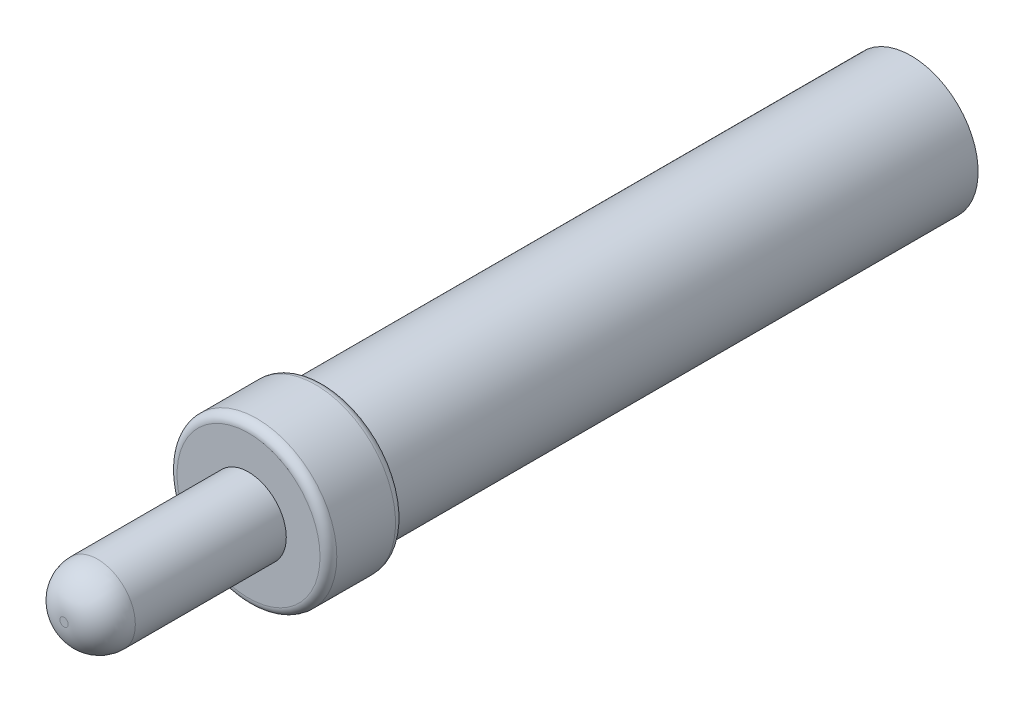
ISO-10303-21;
HEADER;
FILE_DESCRIPTION(('STEP AP214'),'2;1');
FILE_NAME('part.step','',(''),(''),'','','');
FILE_SCHEMA(('AUTOMOTIVE_DESIGN { 1 0 10303 214 1 1 1 1 }'));
ENDSEC;
DATA;
#1=APPLICATION_CONTEXT('core data for automotive mechanical design processes');
#2=APPLICATION_PROTOCOL_DEFINITION('international standard','automotive_design',2000,#1);
#3=PRODUCT_CONTEXT('',#1,'mechanical');
#4=PRODUCT('Part','Part','',(#3));
#5=PRODUCT_RELATED_PRODUCT_CATEGORY('part','',(#4));
#6=PRODUCT_DEFINITION_FORMATION('','',#4);
#7=PRODUCT_DEFINITION_CONTEXT('part definition',#1,'design');
#8=PRODUCT_DEFINITION('design','',#6,#7);
#9=PRODUCT_DEFINITION_SHAPE('','',#8);
#10=(LENGTH_UNIT() NAMED_UNIT(*) SI_UNIT(.MILLI.,.METRE.));
#11=(NAMED_UNIT(*) PLANE_ANGLE_UNIT() SI_UNIT($,.RADIAN.));
#12=(NAMED_UNIT(*) SI_UNIT($,.STERADIAN.) SOLID_ANGLE_UNIT());
#13=UNCERTAINTY_MEASURE_WITH_UNIT(LENGTH_MEASURE(1.E-05),#10,'distance_accuracy_value','');
#14=(GEOMETRIC_REPRESENTATION_CONTEXT(3) GLOBAL_UNCERTAINTY_ASSIGNED_CONTEXT((#13)) GLOBAL_UNIT_ASSIGNED_CONTEXT((#10,
#11,#12)) REPRESENTATION_CONTEXT('',''));
#15=CARTESIAN_POINT('',(0.,0.,0.));
#16=DIRECTION('',(0.,0.,1.));
#17=DIRECTION('',(1.,0.,0.));
#18=AXIS2_PLACEMENT_3D('',#15,#16,#17);
#19=CARTESIAN_POINT('',(240.708388301789,2.59608285867283,50.5));
#20=DIRECTION('',(0.,0.,-1.));
#21=DIRECTION('',(-1.,0.,0.));
#22=AXIS2_PLACEMENT_3D('',#19,#20,#21);
#23=CYLINDRICAL_SURFACE('',#22,4.76250000000001);
#24=CARTESIAN_POINT('',(240.708388301789,2.59608285867283,35.5));
#25=DIRECTION('',(0.,0.,-1.));
#26=DIRECTION('',(-1.,0.,0.));
#27=AXIS2_PLACEMENT_3D('',#24,#25,#26);
#28=CIRCLE('',#27,4.76250000000001);
#29=CARTESIAN_POINT('',(235.945888301789,2.59608285867283,35.5));
#30=VERTEX_POINT('',#29);
#31=EDGE_CURVE('E68',#30,#30,#28,.F.);
#32=ORIENTED_EDGE('',*,*,#31,.T.);
#33=EDGE_LOOP('',(#32));
#34=FACE_BOUND('',#33,.T.);
#35=CARTESIAN_POINT('',(240.708388301789,2.59608285867283,39.));
#36=DIRECTION('',(0.,0.,1.));
#37=DIRECTION('',(1.,0.,0.));
#38=AXIS2_PLACEMENT_3D('',#35,#36,#37);
#39=CIRCLE('',#38,4.76250000000001);
#40=CARTESIAN_POINT('',(245.470888301789,2.59608285867283,39.));
#41=VERTEX_POINT('',#40);
#42=EDGE_CURVE('E59',#41,#41,#39,.F.);
#43=ORIENTED_EDGE('',*,*,#42,.T.);
#44=EDGE_LOOP('',(#43));
#45=FACE_BOUND('',#44,.T.);
#46=ADVANCED_FACE('F35',(#34,#45),#23,.T.);
#47=CARTESIAN_POINT('',(240.708388301789,2.59608285867283,0.));
#48=DIRECTION('',(0.,0.,1.));
#49=DIRECTION('',(1.,0.,0.));
#50=AXIS2_PLACEMENT_3D('',#47,#48,#49);
#51=PLANE('',#50);
#52=CARTESIAN_POINT('',(240.708388301787,2.59608285867252,0.));
#53=DIRECTION('',(0.,0.,-1.));
#54=DIRECTION('',(-1.,0.,0.));
#55=AXIS2_PLACEMENT_3D('',#52,#53,#54);
#56=CIRCLE('',#55,1.25);
#57=CARTESIAN_POINT('',(239.458388301787,2.59608285867252,0.));
#58=VERTEX_POINT('',#57);
#59=EDGE_CURVE('E56',#58,#58,#56,.T.);
#60=ORIENTED_EDGE('',*,*,#59,.F.);
#61=EDGE_LOOP('',(#60));
#62=FACE_BOUND('',#61,.T.);
#63=CARTESIAN_POINT('',(240.708388301787,2.59608285867252,0.));
#64=DIRECTION('',(0.,0.,-1.));
#65=DIRECTION('',(-1.,0.,0.));
#66=AXIS2_PLACEMENT_3D('',#63,#64,#65);
#67=CIRCLE('',#66,3.99999999999999);
#68=CARTESIAN_POINT('',(236.708388301787,2.59608285867252,0.));
#69=VERTEX_POINT('',#68);
#70=EDGE_CURVE('E116',#69,#69,#67,.T.);
#71=ORIENTED_EDGE('',*,*,#70,.T.);
#72=EDGE_LOOP('',(#71));
#73=FACE_BOUND('',#72,.T.);
#74=ADVANCED_FACE('F49',(#62,#73),#51,.F.);
#75=CARTESIAN_POINT('',(240.708388301787,2.59608285867252,8.49999999999999));
#76=DIRECTION('',(0.,0.,-1.));
#77=DIRECTION('',(-1.,0.,0.));
#78=AXIS2_PLACEMENT_3D('',#75,#76,#77);
#79=CONICAL_SURFACE('',#78,1.25,1.02974425867666);
#80=CARTESIAN_POINT('',(240.708388301787,2.59608285867252,9.25107577378444));
#81=VERTEX_POINT('',#80);
#82=VERTEX_LOOP('',#81);
#83=FACE_BOUND('',#82,.T.);
#84=CARTESIAN_POINT('',(240.708388301787,2.59608285867252,8.49999999999999));
#85=DIRECTION('',(0.,0.,-1.));
#86=DIRECTION('',(-1.,0.,0.));
#87=AXIS2_PLACEMENT_3D('',#84,#85,#86);
#88=CIRCLE('',#87,1.25);
#89=CARTESIAN_POINT('',(239.458388301787,2.59608285867252,8.49999999999999));
#90=VERTEX_POINT('',#89);
#91=EDGE_CURVE('E53',#90,#90,#88,.T.);
#92=ORIENTED_EDGE('',*,*,#91,.T.);
#93=EDGE_LOOP('',(#92));
#94=FACE_BOUND('',#93,.T.);
#95=ADVANCED_FACE('F45',(#83,#94),#79,.F.);
#96=CARTESIAN_POINT('',(240.708388301787,2.59608285867252,0.));
#97=DIRECTION('',(0.,0.,-1.));
#98=DIRECTION('',(-1.,0.,0.));
#99=AXIS2_PLACEMENT_3D('',#96,#97,#98);
#100=CYLINDRICAL_SURFACE('',#99,1.25);
#101=ORIENTED_EDGE('',*,*,#91,.F.);
#102=EDGE_LOOP('',(#101));
#103=FACE_BOUND('',#102,.T.);
#104=ORIENTED_EDGE('',*,*,#59,.T.);
#105=EDGE_LOOP('',(#104));
#106=FACE_BOUND('',#105,.T.);
#107=ADVANCED_FACE('F48',(#103,#106),#100,.F.);
#108=CARTESIAN_POINT('',(240.708388301789,2.59608285867283,35.));
#109=DIRECTION('',(0.,0.,-1.));
#110=DIRECTION('',(-1.,0.,0.));
#111=AXIS2_PLACEMENT_3D('',#108,#109,#110);
#112=PLANE('',#111);
#113=CARTESIAN_POINT('',(240.708388301789,2.59608285867283,35.));
#114=DIRECTION('',(0.,0.,-1.));
#115=DIRECTION('',(-1.,0.,0.));
#116=AXIS2_PLACEMENT_3D('',#113,#114,#115);
#117=CIRCLE('',#116,4.26250000000001);
#118=CARTESIAN_POINT('',(236.445888301789,2.59608285867283,35.));
#119=VERTEX_POINT('',#118);
#120=EDGE_CURVE('E55',#119,#119,#117,.T.);
#121=ORIENTED_EDGE('',*,*,#120,.T.);
#122=EDGE_LOOP('',(#121));
#123=FACE_BOUND('',#122,.T.);
#124=CARTESIAN_POINT('',(240.708388301787,2.59608285867252,35.));
#125=DIRECTION('',(0.,0.,-1.));
#126=DIRECTION('',(-1.,0.,0.));
#127=AXIS2_PLACEMENT_3D('',#124,#125,#126);
#128=CIRCLE('',#127,3.99999999999999);
#129=CARTESIAN_POINT('',(236.708388301787,2.59608285867252,35.));
#130=VERTEX_POINT('',#129);
#131=EDGE_CURVE('E62',#130,#130,#128,.T.);
#132=ORIENTED_EDGE('',*,*,#131,.F.);
#133=EDGE_LOOP('',(#132));
#134=FACE_BOUND('',#133,.T.);
#135=ADVANCED_FACE('F108',(#123,#134),#112,.T.);
#136=CARTESIAN_POINT('',(240.708388301787,2.59608285867252,35.));
#137=DIRECTION('',(0.,0.,-1.));
#138=DIRECTION('',(-1.,0.,0.));
#139=AXIS2_PLACEMENT_3D('',#136,#137,#138);
#140=CYLINDRICAL_SURFACE('',#139,3.99999999999999);
#141=ORIENTED_EDGE('',*,*,#131,.T.);
#142=EDGE_LOOP('',(#141));
#143=FACE_BOUND('',#142,.T.);
#144=ORIENTED_EDGE('',*,*,#70,.F.);
#145=EDGE_LOOP('',(#144));
#146=FACE_BOUND('',#145,.T.);
#147=ADVANCED_FACE('F111',(#143,#146),#140,.T.);
#148=CARTESIAN_POINT('',(240.708388301789,2.59608285867283,39.5));
#149=DIRECTION('',(0.,0.,1.));
#150=DIRECTION('',(1.,0.,0.));
#151=AXIS2_PLACEMENT_3D('',#148,#149,#150);
#152=PLANE('',#151);
#153=CARTESIAN_POINT('',(240.708388301789,2.59608285867283,39.5));
#154=DIRECTION('',(0.,0.,1.));
#155=DIRECTION('',(1.,0.,0.));
#156=AXIS2_PLACEMENT_3D('',#153,#154,#155);
#157=CIRCLE('',#156,4.26250000000001);
#158=CARTESIAN_POINT('',(244.970888301789,2.59608285867283,39.5));
#159=VERTEX_POINT('',#158);
#160=EDGE_CURVE('E71',#159,#159,#157,.T.);
#161=ORIENTED_EDGE('',*,*,#160,.T.);
#162=EDGE_LOOP('',(#161));
#163=FACE_BOUND('',#162,.T.);
#164=CARTESIAN_POINT('',(240.708388301789,2.59608285867283,39.5));
#165=DIRECTION('',(0.,0.,1.));
#166=DIRECTION('',(1.,0.,0.));
#167=AXIS2_PLACEMENT_3D('',#164,#165,#166);
#168=CIRCLE('',#167,2.25000000000001);
#169=CARTESIAN_POINT('',(242.958388301789,2.59608285867283,39.5));
#170=VERTEX_POINT('',#169);
#171=EDGE_CURVE('E119',#170,#170,#168,.T.);
#172=ORIENTED_EDGE('',*,*,#171,.F.);
#173=EDGE_LOOP('',(#172));
#174=FACE_BOUND('',#173,.T.);
#175=ADVANCED_FACE('F125',(#163,#174),#152,.T.);
#176=CARTESIAN_POINT('',(240.708388301789,2.59608285867283,39.5));
#177=DIRECTION('',(0.,0.,1.));
#178=DIRECTION('',(1.,0.,0.));
#179=AXIS2_PLACEMENT_3D('',#176,#177,#178);
#180=CYLINDRICAL_SURFACE('',#179,2.25000000000001);
#181=CARTESIAN_POINT('',(240.708388301789,2.59608285867283,48.5));
#182=DIRECTION('',(0.,0.,1.));
#183=DIRECTION('',(1.,0.,0.));
#184=AXIS2_PLACEMENT_3D('',#181,#182,#183);
#185=CIRCLE('',#184,2.25000000000001);
#186=CARTESIAN_POINT('',(242.958388301789,2.59608285867283,48.5));
#187=VERTEX_POINT('',#186);
#188=EDGE_CURVE('E12',#187,#187,#185,.F.);
#189=ORIENTED_EDGE('',*,*,#188,.T.);
#190=EDGE_LOOP('',(#189));
#191=FACE_BOUND('',#190,.T.);
#192=ORIENTED_EDGE('',*,*,#171,.T.);
#193=EDGE_LOOP('',(#192));
#194=FACE_BOUND('',#193,.T.);
#195=ADVANCED_FACE('F103',(#191,#194),#180,.T.);
#196=CARTESIAN_POINT('',(240.708388301789,2.59608285867283,50.5));
#197=DIRECTION('',(0.,0.,1.));
#198=DIRECTION('',(1.,0.,0.));
#199=AXIS2_PLACEMENT_3D('',#196,#197,#198);
#200=PLANE('',#199);
#201=CARTESIAN_POINT('',(240.708388301789,2.59608285867283,50.5));
#202=DIRECTION('',(0.,0.,1.));
#203=DIRECTION('',(1.,0.,0.));
#204=AXIS2_PLACEMENT_3D('',#201,#202,#203);
#205=CIRCLE('',#204,0.250000000000009);
#206=CARTESIAN_POINT('',(240.958388301789,2.59608285867283,50.5));
#207=VERTEX_POINT('',#206);
#208=EDGE_CURVE('E42',#207,#207,#205,.T.);
#209=ORIENTED_EDGE('',*,*,#208,.T.);
#210=EDGE_LOOP('',(#209));
#211=FACE_BOUND('',#210,.T.);
#212=ADVANCED_FACE('F76',(#211),#200,.T.);
#213=CARTESIAN_POINT('',(240.708388301789,2.59608285867283,35.5));
#214=DIRECTION('',(0.,0.,-1.));
#215=DIRECTION('',(-1.,0.,0.));
#216=AXIS2_PLACEMENT_3D('',#213,#214,#215);
#217=TOROIDAL_SURFACE('',#216,4.26250000000001,0.5);
#218=ORIENTED_EDGE('',*,*,#31,.F.);
#219=EDGE_LOOP('',(#218));
#220=FACE_BOUND('',#219,.T.);
#221=ORIENTED_EDGE('',*,*,#120,.F.);
#222=EDGE_LOOP('',(#221));
#223=FACE_BOUND('',#222,.T.);
#224=ADVANCED_FACE('F84',(#220,#223),#217,.T.);
#225=CARTESIAN_POINT('',(240.708388301789,2.59608285867283,39.));
#226=DIRECTION('',(0.,0.,1.));
#227=DIRECTION('',(1.,0.,0.));
#228=AXIS2_PLACEMENT_3D('',#225,#226,#227);
#229=TOROIDAL_SURFACE('',#228,4.26250000000001,0.5);
#230=ORIENTED_EDGE('',*,*,#42,.F.);
#231=EDGE_LOOP('',(#230));
#232=FACE_BOUND('',#231,.T.);
#233=ORIENTED_EDGE('',*,*,#160,.F.);
#234=EDGE_LOOP('',(#233));
#235=FACE_BOUND('',#234,.T.);
#236=ADVANCED_FACE('F79',(#232,#235),#229,.T.);
#237=CARTESIAN_POINT('',(240.708388301789,2.59608285867283,48.5));
#238=DIRECTION('',(0.,0.,1.));
#239=DIRECTION('',(1.,0.,0.));
#240=AXIS2_PLACEMENT_3D('',#237,#238,#239);
#241=DEGENERATE_TOROIDAL_SURFACE('',#240,0.250000000000009,2.,.T.);
#242=ORIENTED_EDGE('',*,*,#188,.F.);
#243=EDGE_LOOP('',(#242));
#244=FACE_BOUND('',#243,.T.);
#245=ORIENTED_EDGE('',*,*,#208,.F.);
#246=EDGE_LOOP('',(#245));
#247=FACE_BOUND('',#246,.T.);
#248=ADVANCED_FACE('F37',(#244,#247),#241,.T.);
#249=CLOSED_SHELL('',(#46,#74,#95,#107,#135,#147,#175,#195,#212,#224,#236,#248));
#250=MANIFOLD_SOLID_BREP('B2',#249);
#251=ADVANCED_BREP_SHAPE_REPRESENTATION('',(#18,#250),#14);
#252=SHAPE_DEFINITION_REPRESENTATION(#9,#251);
ENDSEC;
END-ISO-10303-21;
